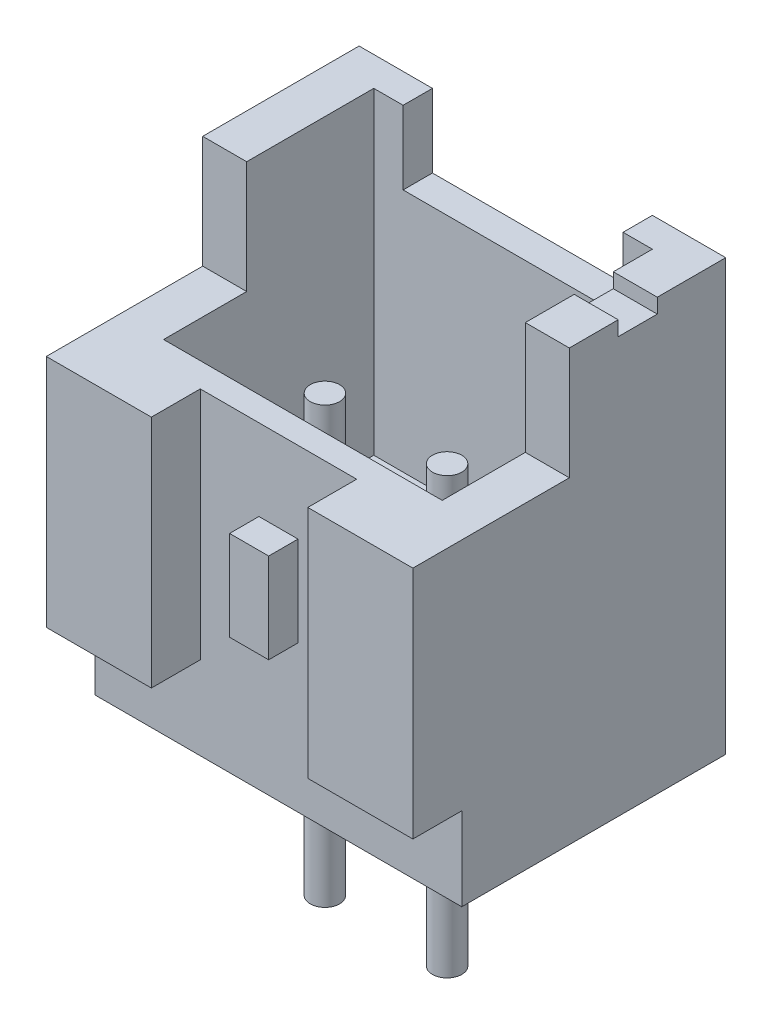
ISO-10303-21;
HEADER;
FILE_DESCRIPTION(('STEP AP214'),'2;1');
FILE_NAME('part.step','',(''),(''),'','','');
FILE_SCHEMA(('AUTOMOTIVE_DESIGN { 1 0 10303 214 1 1 1 1 }'));
ENDSEC;
DATA;
#1=APPLICATION_CONTEXT('core data for automotive mechanical design processes');
#2=APPLICATION_PROTOCOL_DEFINITION('international standard','automotive_design',2000,#1);
#3=PRODUCT_CONTEXT('',#1,'mechanical');
#4=PRODUCT('Part','Part','',(#3));
#5=PRODUCT_RELATED_PRODUCT_CATEGORY('part','',(#4));
#6=PRODUCT_DEFINITION_FORMATION('','',#4);
#7=PRODUCT_DEFINITION_CONTEXT('part definition',#1,'design');
#8=PRODUCT_DEFINITION('design','',#6,#7);
#9=PRODUCT_DEFINITION_SHAPE('','',#8);
#10=(LENGTH_UNIT() NAMED_UNIT(*) SI_UNIT(.MILLI.,.METRE.));
#11=(NAMED_UNIT(*) PLANE_ANGLE_UNIT() SI_UNIT($,.RADIAN.));
#12=(NAMED_UNIT(*) SI_UNIT($,.STERADIAN.) SOLID_ANGLE_UNIT());
#13=UNCERTAINTY_MEASURE_WITH_UNIT(LENGTH_MEASURE(1.E-05),#10,'distance_accuracy_value','');
#14=(GEOMETRIC_REPRESENTATION_CONTEXT(3) GLOBAL_UNCERTAINTY_ASSIGNED_CONTEXT((#13)) GLOBAL_UNIT_ASSIGNED_CONTEXT((#10,
#11,#12)) REPRESENTATION_CONTEXT('',''));
#15=CARTESIAN_POINT('',(0.,0.,0.));
#16=DIRECTION('',(0.,0.,1.));
#17=DIRECTION('',(1.,0.,0.));
#18=AXIS2_PLACEMENT_3D('',#15,#16,#17);
#19=CARTESIAN_POINT('',(1.25,5.5,0.));
#20=DIRECTION('',(0.,1.,0.));
#21=DIRECTION('',(0.,0.,1.));
#22=AXIS2_PLACEMENT_3D('',#19,#20,#21);
#23=PLANE('',#22);
#24=CARTESIAN_POINT('',(1.25,5.5,0.));
#25=DIRECTION('',(0.,-1.,0.));
#26=DIRECTION('',(0.,0.,-1.));
#27=AXIS2_PLACEMENT_3D('',#24,#25,#26);
#28=CIRCLE('',#27,0.3);
#29=CARTESIAN_POINT('',(1.25,5.5,-0.3));
#30=VERTEX_POINT('',#29);
#31=EDGE_CURVE('E20',#30,#30,#28,.T.);
#32=ORIENTED_EDGE('',*,*,#31,.F.);
#33=EDGE_LOOP('',(#32));
#34=FACE_BOUND('',#33,.T.);
#35=ADVANCED_FACE('F17',(#34),#23,.T.);
#36=CARTESIAN_POINT('',(-1.25,5.5,0.));
#37=DIRECTION('',(0.,1.,0.));
#38=DIRECTION('',(0.,0.,1.));
#39=AXIS2_PLACEMENT_3D('',#36,#37,#38);
#40=PLANE('',#39);
#41=CARTESIAN_POINT('',(-1.25,5.5,0.));
#42=DIRECTION('',(0.,-1.,0.));
#43=DIRECTION('',(0.,0.,-1.));
#44=AXIS2_PLACEMENT_3D('',#41,#42,#43);
#45=CIRCLE('',#44,0.3);
#46=CARTESIAN_POINT('',(-1.25,5.5,-0.3));
#47=VERTEX_POINT('',#46);
#48=EDGE_CURVE('E232',#47,#47,#45,.T.);
#49=ORIENTED_EDGE('',*,*,#48,.F.);
#50=EDGE_LOOP('',(#49));
#51=FACE_BOUND('',#50,.T.);
#52=ADVANCED_FACE('F280',(#51),#40,.T.);
#53=CARTESIAN_POINT('',(0.4,3.8,2.8));
#54=DIRECTION('',(0.,0.,-1.));
#55=DIRECTION('',(0.,1.,0.));
#56=AXIS2_PLACEMENT_3D('',#53,#54,#55);
#57=PLANE('',#56);
#58=DIRECTION('',(1.,0.,0.));
#59=VECTOR('',#58,1.);
#60=CARTESIAN_POINT('',(0.4,3.,2.8));
#61=LINE('',#60,#59);
#62=CARTESIAN_POINT('',(-0.4,3.,2.8));
#63=VERTEX_POINT('',#62);
#64=CARTESIAN_POINT('',(0.4,3.,2.8));
#65=VERTEX_POINT('',#64);
#66=EDGE_CURVE('E215',#63,#65,#61,.T.);
#67=ORIENTED_EDGE('',*,*,#66,.T.);
#68=DIRECTION('',(0.,1.,0.));
#69=VECTOR('',#68,1.);
#70=CARTESIAN_POINT('',(0.4,4.839230484541,2.8));
#71=LINE('',#70,#69);
#72=CARTESIAN_POINT('',(0.4,4.839230484541,2.8));
#73=VERTEX_POINT('',#72);
#74=EDGE_CURVE('E210',#73,#65,#71,.F.);
#75=ORIENTED_EDGE('',*,*,#74,.F.);
#76=DIRECTION('',(1.,0.,0.));
#77=VECTOR('',#76,1.);
#78=CARTESIAN_POINT('',(0.4,4.839230484541,2.8));
#79=LINE('',#78,#77);
#80=CARTESIAN_POINT('',(-0.4,4.839230484541,2.8));
#81=VERTEX_POINT('',#80);
#82=EDGE_CURVE('E228',#81,#73,#79,.T.);
#83=ORIENTED_EDGE('',*,*,#82,.F.);
#84=DIRECTION('',(0.,1.,0.));
#85=VECTOR('',#84,1.);
#86=CARTESIAN_POINT('',(-0.4,4.839230484541,2.8));
#87=LINE('',#86,#85);
#88=EDGE_CURVE('E224',#81,#63,#87,.F.);
#89=ORIENTED_EDGE('',*,*,#88,.T.);
#90=EDGE_LOOP('',(#67,#75,#83,#89));
#91=FACE_BOUND('',#90,.T.);
#92=ADVANCED_FACE('F227',(#91),#57,.F.);
#93=CARTESIAN_POINT('',(1.25,5.5,0.));
#94=DIRECTION('',(0.,-1.,0.));
#95=DIRECTION('',(0.,0.,-1.));
#96=AXIS2_PLACEMENT_3D('',#93,#94,#95);
#97=CYLINDRICAL_SURFACE('',#96,0.3);
#98=ORIENTED_EDGE('',*,*,#31,.T.);
#99=EDGE_LOOP('',(#98));
#100=FACE_BOUND('',#99,.T.);
#101=CARTESIAN_POINT('',(1.25,2.3,0.));
#102=DIRECTION('',(0.,-1.,0.));
#103=DIRECTION('',(0.,0.,-1.));
#104=AXIS2_PLACEMENT_3D('',#101,#102,#103);
#105=CIRCLE('',#104,0.3);
#106=CARTESIAN_POINT('',(1.25,2.3,-0.3));
#107=VERTEX_POINT('',#106);
#108=EDGE_CURVE('E266',#107,#107,#105,.F.);
#109=ORIENTED_EDGE('',*,*,#108,.T.);
#110=EDGE_LOOP('',(#109));
#111=FACE_BOUND('',#110,.T.);
#112=ADVANCED_FACE('F276',(#100,#111),#97,.T.);
#113=CARTESIAN_POINT('',(-1.25,5.5,0.));
#114=DIRECTION('',(0.,-1.,0.));
#115=DIRECTION('',(0.,0.,-1.));
#116=AXIS2_PLACEMENT_3D('',#113,#114,#115);
#117=CYLINDRICAL_SURFACE('',#116,0.3);
#118=ORIENTED_EDGE('',*,*,#48,.T.);
#119=EDGE_LOOP('',(#118));
#120=FACE_BOUND('',#119,.T.);
#121=CARTESIAN_POINT('',(-1.25,2.3,0.));
#122=DIRECTION('',(0.,-1.,0.));
#123=DIRECTION('',(0.,0.,-1.));
#124=AXIS2_PLACEMENT_3D('',#121,#122,#123);
#125=CIRCLE('',#124,0.3);
#126=CARTESIAN_POINT('',(-1.25,2.3,-0.3));
#127=VERTEX_POINT('',#126);
#128=EDGE_CURVE('E261',#127,#127,#125,.F.);
#129=ORIENTED_EDGE('',*,*,#128,.T.);
#130=EDGE_LOOP('',(#129));
#131=FACE_BOUND('',#130,.T.);
#132=ADVANCED_FACE('F426',(#120,#131),#117,.T.);
#133=CARTESIAN_POINT('',(1.25,-3.4,0.));
#134=DIRECTION('',(0.,1.,0.));
#135=DIRECTION('',(0.,0.,1.));
#136=AXIS2_PLACEMENT_3D('',#133,#134,#135);
#137=PLANE('',#136);
#138=CARTESIAN_POINT('',(1.25,-3.4,0.));
#139=DIRECTION('',(0.,-1.,0.));
#140=DIRECTION('',(0.,0.,-1.));
#141=AXIS2_PLACEMENT_3D('',#138,#139,#140);
#142=CIRCLE('',#141,0.3);
#143=CARTESIAN_POINT('',(1.25,-3.4,-0.3));
#144=VERTEX_POINT('',#143);
#145=EDGE_CURVE('E257',#144,#144,#142,.F.);
#146=ORIENTED_EDGE('',*,*,#145,.F.);
#147=EDGE_LOOP('',(#146));
#148=FACE_BOUND('',#147,.T.);
#149=ADVANCED_FACE('F423',(#148),#137,.F.);
#150=CARTESIAN_POINT('',(-0.4,4.839230484541,2.2));
#151=DIRECTION('',(1.,0.,0.));
#152=DIRECTION('',(0.,0.,-1.));
#153=AXIS2_PLACEMENT_3D('',#150,#151,#152);
#154=PLANE('',#153);
#155=DIRECTION('',(0.,1.,0.));
#156=VECTOR('',#155,1.);
#157=CARTESIAN_POINT('',(-0.4,0.,2.2));
#158=LINE('',#157,#156);
#159=CARTESIAN_POINT('',(-0.4,4.839230484541,2.2));
#160=VERTEX_POINT('',#159);
#161=CARTESIAN_POINT('',(-0.4,3.,2.2));
#162=VERTEX_POINT('',#161);
#163=EDGE_CURVE('E236',#160,#162,#158,.F.);
#164=ORIENTED_EDGE('',*,*,#163,.T.);
#165=DIRECTION('',(0.,0.,1.));
#166=VECTOR('',#165,1.);
#167=CARTESIAN_POINT('',(-0.4,3.,2.8));
#168=LINE('',#167,#166);
#169=EDGE_CURVE('E220',#162,#63,#168,.T.);
#170=ORIENTED_EDGE('',*,*,#169,.T.);
#171=ORIENTED_EDGE('',*,*,#88,.F.);
#172=DIRECTION('',(0.,0.,-1.));
#173=VECTOR('',#172,1.);
#174=CARTESIAN_POINT('',(-0.4,4.839230484541,2.8));
#175=LINE('',#174,#173);
#176=EDGE_CURVE('E858',#81,#160,#175,.T.);
#177=ORIENTED_EDGE('',*,*,#176,.T.);
#178=EDGE_LOOP('',(#164,#170,#171,#177));
#179=FACE_BOUND('',#178,.T.);
#180=ADVANCED_FACE('F235',(#179),#154,.F.);
#181=CARTESIAN_POINT('',(0.4,3.,2.8));
#182=DIRECTION('',(0.,1.,0.));
#183=DIRECTION('',(0.,0.,1.));
#184=AXIS2_PLACEMENT_3D('',#181,#182,#183);
#185=PLANE('',#184);
#186=DIRECTION('',(-1.,0.,0.));
#187=VECTOR('',#186,1.);
#188=CARTESIAN_POINT('',(-1.6,3.,2.2));
#189=LINE('',#188,#187);
#190=CARTESIAN_POINT('',(0.4,3.,2.2));
#191=VERTEX_POINT('',#190);
#192=EDGE_CURVE('E817',#162,#191,#189,.F.);
#193=ORIENTED_EDGE('',*,*,#192,.T.);
#194=DIRECTION('',(0.,0.,-1.));
#195=VECTOR('',#194,1.);
#196=CARTESIAN_POINT('',(0.4,3.,2.2));
#197=LINE('',#196,#195);
#198=EDGE_CURVE('E222',#65,#191,#197,.T.);
#199=ORIENTED_EDGE('',*,*,#198,.F.);
#200=ORIENTED_EDGE('',*,*,#66,.F.);
#201=ORIENTED_EDGE('',*,*,#169,.F.);
#202=EDGE_LOOP('',(#193,#199,#200,#201));
#203=FACE_BOUND('',#202,.T.);
#204=ADVANCED_FACE('F218',(#203),#185,.F.);
#205=CARTESIAN_POINT('',(0.4,4.839230484541,2.2));
#206=DIRECTION('',(1.,0.,0.));
#207=DIRECTION('',(0.,0.,-1.));
#208=AXIS2_PLACEMENT_3D('',#205,#206,#207);
#209=PLANE('',#208);
#210=ORIENTED_EDGE('',*,*,#198,.T.);
#211=DIRECTION('',(0.,1.,0.));
#212=VECTOR('',#211,1.);
#213=CARTESIAN_POINT('',(0.4,0.,2.2));
#214=LINE('',#213,#212);
#215=CARTESIAN_POINT('',(0.4,4.839230484541,2.2));
#216=VERTEX_POINT('',#215);
#217=EDGE_CURVE('E814',#191,#216,#214,.T.);
#218=ORIENTED_EDGE('',*,*,#217,.T.);
#219=DIRECTION('',(0.,0.,-1.));
#220=VECTOR('',#219,1.);
#221=CARTESIAN_POINT('',(0.4,4.839230484541,2.8));
#222=LINE('',#221,#220);
#223=EDGE_CURVE('E860',#216,#73,#222,.F.);
#224=ORIENTED_EDGE('',*,*,#223,.T.);
#225=ORIENTED_EDGE('',*,*,#74,.T.);
#226=EDGE_LOOP('',(#210,#218,#224,#225));
#227=FACE_BOUND('',#226,.T.);
#228=ADVANCED_FACE('F415',(#227),#209,.T.);
#229=CARTESIAN_POINT('',(0.4,4.839230484541,2.8));
#230=DIRECTION('',(0.,-1.,0.));
#231=DIRECTION('',(0.,0.,-1.));
#232=AXIS2_PLACEMENT_3D('',#229,#230,#231);
#233=PLANE('',#232);
#234=ORIENTED_EDGE('',*,*,#82,.T.);
#235=ORIENTED_EDGE('',*,*,#223,.F.);
#236=DIRECTION('',(-1.,0.,0.));
#237=VECTOR('',#236,1.);
#238=CARTESIAN_POINT('',(-1.6,4.839230484541,2.2));
#239=LINE('',#238,#237);
#240=EDGE_CURVE('E811',#216,#160,#239,.T.);
#241=ORIENTED_EDGE('',*,*,#240,.T.);
#242=ORIENTED_EDGE('',*,*,#176,.F.);
#243=EDGE_LOOP('',(#234,#235,#241,#242));
#244=FACE_BOUND('',#243,.T.);
#245=ADVANCED_FACE('F411',(#244),#233,.F.);
#246=CARTESIAN_POINT('',(-1.6,1.7,2.2));
#247=DIRECTION('',(0.,1.,0.));
#248=DIRECTION('',(0.,0.,1.));
#249=AXIS2_PLACEMENT_3D('',#246,#247,#248);
#250=PLANE('',#249);
#251=DIRECTION('',(0.,0.,1.));
#252=VECTOR('',#251,1.);
#253=CARTESIAN_POINT('',(-3.75,1.7,2.2));
#254=LINE('',#253,#252);
#255=CARTESIAN_POINT('',(-3.75,1.7,2.2));
#256=VERTEX_POINT('',#255);
#257=CARTESIAN_POINT('',(-3.75,1.7,3.2));
#258=VERTEX_POINT('',#257);
#259=EDGE_CURVE('E856',#256,#258,#254,.T.);
#260=ORIENTED_EDGE('',*,*,#259,.F.);
#261=DIRECTION('',(-1.,0.,0.));
#262=VECTOR('',#261,1.);
#263=CARTESIAN_POINT('',(-1.6,1.7,2.2));
#264=LINE('',#263,#262);
#265=CARTESIAN_POINT('',(-1.6,1.7,2.2));
#266=VERTEX_POINT('',#265);
#267=EDGE_CURVE('E800',#256,#266,#264,.F.);
#268=ORIENTED_EDGE('',*,*,#267,.T.);
#269=DIRECTION('',(0.,0.,1.));
#270=VECTOR('',#269,1.);
#271=CARTESIAN_POINT('',(-1.6,1.7,3.2));
#272=LINE('',#271,#270);
#273=CARTESIAN_POINT('',(-1.6,1.7,3.2));
#274=VERTEX_POINT('',#273);
#275=EDGE_CURVE('E851',#266,#274,#272,.T.);
#276=ORIENTED_EDGE('',*,*,#275,.T.);
#277=DIRECTION('',(1.,0.,0.));
#278=VECTOR('',#277,1.);
#279=CARTESIAN_POINT('',(-3.75,1.7,3.2));
#280=LINE('',#279,#278);
#281=EDGE_CURVE('E822',#258,#274,#280,.T.);
#282=ORIENTED_EDGE('',*,*,#281,.F.);
#283=EDGE_LOOP('',(#260,#268,#276,#282));
#284=FACE_BOUND('',#283,.T.);
#285=ADVANCED_FACE('F407',(#284),#250,.F.);
#286=CARTESIAN_POINT('',(-1.6,0.,3.2));
#287=DIRECTION('',(-1.,0.,0.));
#288=DIRECTION('',(0.,0.,1.));
#289=AXIS2_PLACEMENT_3D('',#286,#287,#288);
#290=PLANE('',#289);
#291=ORIENTED_EDGE('',*,*,#275,.F.);
#292=DIRECTION('',(0.,1.,0.));
#293=VECTOR('',#292,1.);
#294=CARTESIAN_POINT('',(-1.6,0.,2.2));
#295=LINE('',#294,#293);
#296=CARTESIAN_POINT('',(-1.6,6.5,2.2));
#297=VERTEX_POINT('',#296);
#298=EDGE_CURVE('E256',#266,#297,#295,.T.);
#299=ORIENTED_EDGE('',*,*,#298,.T.);
#300=DIRECTION('',(0.,0.,1.));
#301=VECTOR('',#300,1.);
#302=CARTESIAN_POINT('',(-1.6,6.5,3.2));
#303=LINE('',#302,#301);
#304=CARTESIAN_POINT('',(-1.6,6.5,3.2));
#305=VERTEX_POINT('',#304);
#306=EDGE_CURVE('E854',#305,#297,#303,.F.);
#307=ORIENTED_EDGE('',*,*,#306,.F.);
#308=DIRECTION('',(0.,1.,0.));
#309=VECTOR('',#308,1.);
#310=CARTESIAN_POINT('',(-1.6,0.,3.2));
#311=LINE('',#310,#309);
#312=EDGE_CURVE('E260',#274,#305,#311,.T.);
#313=ORIENTED_EDGE('',*,*,#312,.F.);
#314=EDGE_LOOP('',(#291,#299,#307,#313));
#315=FACE_BOUND('',#314,.T.);
#316=ADVANCED_FACE('F403',(#315),#290,.F.);
#317=CARTESIAN_POINT('',(-1.25,-3.4,0.));
#318=DIRECTION('',(0.,1.,0.));
#319=DIRECTION('',(0.,0.,1.));
#320=AXIS2_PLACEMENT_3D('',#317,#318,#319);
#321=PLANE('',#320);
#322=CARTESIAN_POINT('',(-1.25,-3.4,0.));
#323=DIRECTION('',(0.,-1.,0.));
#324=DIRECTION('',(0.,0.,-1.));
#325=AXIS2_PLACEMENT_3D('',#322,#323,#324);
#326=CIRCLE('',#325,0.3);
#327=CARTESIAN_POINT('',(-1.25,-3.4,-0.3));
#328=VERTEX_POINT('',#327);
#329=EDGE_CURVE('E252',#328,#328,#326,.F.);
#330=ORIENTED_EDGE('',*,*,#329,.F.);
#331=EDGE_LOOP('',(#330));
#332=FACE_BOUND('',#331,.T.);
#333=ADVANCED_FACE('F399',(#332),#321,.F.);
#334=CARTESIAN_POINT('',(1.6,1.7,2.2));
#335=DIRECTION('',(0.,1.,0.));
#336=DIRECTION('',(-1.,0.,0.));
#337=AXIS2_PLACEMENT_3D('',#334,#335,#336);
#338=PLANE('',#337);
#339=DIRECTION('',(0.,0.,-1.));
#340=VECTOR('',#339,1.);
#341=CARTESIAN_POINT('',(1.6,1.7,3.2));
#342=LINE('',#341,#340);
#343=CARTESIAN_POINT('',(1.6,1.7,3.2));
#344=VERTEX_POINT('',#343);
#345=CARTESIAN_POINT('',(1.6,1.7,2.2));
#346=VERTEX_POINT('',#345);
#347=EDGE_CURVE('E845',#344,#346,#342,.T.);
#348=ORIENTED_EDGE('',*,*,#347,.T.);
#349=DIRECTION('',(-1.,0.,0.));
#350=VECTOR('',#349,1.);
#351=CARTESIAN_POINT('',(-1.6,1.7,2.2));
#352=LINE('',#351,#350);
#353=CARTESIAN_POINT('',(3.75,1.7,2.2));
#354=VERTEX_POINT('',#353);
#355=EDGE_CURVE('E805',#346,#354,#352,.F.);
#356=ORIENTED_EDGE('',*,*,#355,.T.);
#357=DIRECTION('',(0.,0.,1.));
#358=VECTOR('',#357,1.);
#359=CARTESIAN_POINT('',(3.75,1.7,2.2));
#360=LINE('',#359,#358);
#361=CARTESIAN_POINT('',(3.75,1.7,3.2));
#362=VERTEX_POINT('',#361);
#363=EDGE_CURVE('E849',#362,#354,#360,.F.);
#364=ORIENTED_EDGE('',*,*,#363,.F.);
#365=DIRECTION('',(1.,0.,0.));
#366=VECTOR('',#365,1.);
#367=CARTESIAN_POINT('',(-3.75,1.7,3.2));
#368=LINE('',#367,#366);
#369=EDGE_CURVE('E255',#344,#362,#368,.T.);
#370=ORIENTED_EDGE('',*,*,#369,.F.);
#371=EDGE_LOOP('',(#348,#356,#364,#370));
#372=FACE_BOUND('',#371,.T.);
#373=ADVANCED_FACE('F395',(#372),#338,.F.);
#374=CARTESIAN_POINT('',(1.6,0.,3.2));
#375=DIRECTION('',(1.,0.,0.));
#376=DIRECTION('',(0.,0.,-1.));
#377=AXIS2_PLACEMENT_3D('',#374,#375,#376);
#378=PLANE('',#377);
#379=ORIENTED_EDGE('',*,*,#347,.F.);
#380=DIRECTION('',(0.,1.,0.));
#381=VECTOR('',#380,1.);
#382=CARTESIAN_POINT('',(1.6,0.,3.2));
#383=LINE('',#382,#381);
#384=CARTESIAN_POINT('',(1.6,6.5,3.2));
#385=VERTEX_POINT('',#384);
#386=EDGE_CURVE('E793',#385,#344,#383,.F.);
#387=ORIENTED_EDGE('',*,*,#386,.F.);
#388=DIRECTION('',(0.,0.,-1.));
#389=VECTOR('',#388,1.);
#390=CARTESIAN_POINT('',(1.6,6.5,3.2));
#391=LINE('',#390,#389);
#392=CARTESIAN_POINT('',(1.6,6.5,2.2));
#393=VERTEX_POINT('',#392);
#394=EDGE_CURVE('E847',#393,#385,#391,.F.);
#395=ORIENTED_EDGE('',*,*,#394,.F.);
#396=DIRECTION('',(0.,1.,0.));
#397=VECTOR('',#396,1.);
#398=CARTESIAN_POINT('',(1.6,0.,2.2));
#399=LINE('',#398,#397);
#400=EDGE_CURVE('E808',#393,#346,#399,.F.);
#401=ORIENTED_EDGE('',*,*,#400,.T.);
#402=EDGE_LOOP('',(#379,#387,#395,#401));
#403=FACE_BOUND('',#402,.T.);
#404=ADVANCED_FACE('F391',(#403),#378,.F.);
#405=CARTESIAN_POINT('',(-2.85,2.3,1.7));
#406=DIRECTION('',(0.,0.,1.));
#407=DIRECTION('',(1.,0.,0.));
#408=AXIS2_PLACEMENT_3D('',#405,#406,#407);
#409=PLANE('',#408);
#410=DIRECTION('',(1.,0.,0.));
#411=VECTOR('',#410,1.);
#412=CARTESIAN_POINT('',(2.85,2.3,1.7));
#413=LINE('',#412,#411);
#414=CARTESIAN_POINT('',(2.85,2.3,1.7));
#415=VERTEX_POINT('',#414);
#416=CARTESIAN_POINT('',(-2.85,2.3,1.7));
#417=VERTEX_POINT('',#416);
#418=EDGE_CURVE('E268',#415,#417,#413,.F.);
#419=ORIENTED_EDGE('',*,*,#418,.T.);
#420=DIRECTION('',(0.,1.,0.));
#421=VECTOR('',#420,1.);
#422=CARTESIAN_POINT('',(-2.85,2.3,1.7));
#423=LINE('',#422,#421);
#424=CARTESIAN_POINT('',(-2.85,6.5,1.7));
#425=VERTEX_POINT('',#424);
#426=EDGE_CURVE('E836',#417,#425,#423,.T.);
#427=ORIENTED_EDGE('',*,*,#426,.T.);
#428=DIRECTION('',(1.,0.,0.));
#429=VECTOR('',#428,1.);
#430=CARTESIAN_POINT('',(-3.75,6.5,1.7));
#431=LINE('',#430,#429);
#432=CARTESIAN_POINT('',(2.85,6.5,1.7));
#433=VERTEX_POINT('',#432);
#434=EDGE_CURVE('E776',#425,#433,#431,.T.);
#435=ORIENTED_EDGE('',*,*,#434,.T.);
#436=DIRECTION('',(0.,1.,0.));
#437=VECTOR('',#436,1.);
#438=CARTESIAN_POINT('',(2.85,2.3,1.7));
#439=LINE('',#438,#437);
#440=EDGE_CURVE('E842',#433,#415,#439,.F.);
#441=ORIENTED_EDGE('',*,*,#440,.T.);
#442=EDGE_LOOP('',(#419,#427,#435,#441));
#443=FACE_BOUND('',#442,.T.);
#444=ADVANCED_FACE('F387',(#443),#409,.F.);
#445=CARTESIAN_POINT('',(2.85,2.3,1.7));
#446=DIRECTION('',(1.,0.,0.));
#447=DIRECTION('',(0.,0.,-1.));
#448=AXIS2_PLACEMENT_3D('',#445,#446,#447);
#449=PLANE('',#448);
#450=DIRECTION('',(0.,1.,0.));
#451=VECTOR('',#450,1.);
#452=CARTESIAN_POINT('',(2.85,8.5,-1.8));
#453=LINE('',#452,#451);
#454=CARTESIAN_POINT('',(2.85,8.5,-1.8));
#455=VERTEX_POINT('',#454);
#456=CARTESIAN_POINT('',(2.85,8.8,-1.8));
#457=VERTEX_POINT('',#456);
#458=EDGE_CURVE('E744',#455,#457,#453,.T.);
#459=ORIENTED_EDGE('',*,*,#458,.T.);
#460=DIRECTION('',(0.,0.,-1.));
#461=VECTOR('',#460,1.);
#462=CARTESIAN_POINT('',(2.85,8.8,1.7));
#463=LINE('',#462,#461);
#464=CARTESIAN_POINT('',(2.85,8.8,-2.6));
#465=VERTEX_POINT('',#464);
#466=EDGE_CURVE('E269',#465,#457,#463,.F.);
#467=ORIENTED_EDGE('',*,*,#466,.F.);
#468=DIRECTION('',(0.,1.,0.));
#469=VECTOR('',#468,1.);
#470=CARTESIAN_POINT('',(2.85,2.3,-2.6));
#471=LINE('',#470,#469);
#472=CARTESIAN_POINT('',(2.85,2.3,-2.6));
#473=VERTEX_POINT('',#472);
#474=EDGE_CURVE('E739',#465,#473,#471,.F.);
#475=ORIENTED_EDGE('',*,*,#474,.T.);
#476=DIRECTION('',(0.,0.,-1.));
#477=VECTOR('',#476,1.);
#478=CARTESIAN_POINT('',(2.85,2.3,-2.6));
#479=LINE('',#478,#477);
#480=EDGE_CURVE('E265',#473,#415,#479,.F.);
#481=ORIENTED_EDGE('',*,*,#480,.T.);
#482=ORIENTED_EDGE('',*,*,#440,.F.);
#483=DIRECTION('',(0.,0.,1.));
#484=VECTOR('',#483,1.);
#485=CARTESIAN_POINT('',(2.85,6.5,3.2));
#486=LINE('',#485,#484);
#487=CARTESIAN_POINT('',(2.85,6.5,0.));
#488=VERTEX_POINT('',#487);
#489=EDGE_CURVE('E774',#433,#488,#486,.F.);
#490=ORIENTED_EDGE('',*,*,#489,.T.);
#491=DIRECTION('',(0.,1.,0.));
#492=VECTOR('',#491,1.);
#493=CARTESIAN_POINT('',(2.85,8.8,0.));
#494=LINE('',#493,#492);
#495=CARTESIAN_POINT('',(2.85,8.8,0.));
#496=VERTEX_POINT('',#495);
#497=EDGE_CURVE('E769',#488,#496,#494,.T.);
#498=ORIENTED_EDGE('',*,*,#497,.T.);
#499=DIRECTION('',(0.,0.,-1.));
#500=VECTOR('',#499,1.);
#501=CARTESIAN_POINT('',(2.85,8.8,3.2));
#502=LINE('',#501,#500);
#503=CARTESIAN_POINT('',(2.85,8.8,-1.));
#504=VERTEX_POINT('',#503);
#505=EDGE_CURVE('E763',#496,#504,#502,.T.);
#506=ORIENTED_EDGE('',*,*,#505,.T.);
#507=DIRECTION('',(0.,1.,0.));
#508=VECTOR('',#507,1.);
#509=CARTESIAN_POINT('',(2.85,8.5,-1.));
#510=LINE('',#509,#508);
#511=CARTESIAN_POINT('',(2.85,8.5,-1.));
#512=VERTEX_POINT('',#511);
#513=EDGE_CURVE('E760',#504,#512,#510,.F.);
#514=ORIENTED_EDGE('',*,*,#513,.T.);
#515=DIRECTION('',(0.,0.,1.));
#516=VECTOR('',#515,1.);
#517=CARTESIAN_POINT('',(2.85,8.5,-1.));
#518=LINE('',#517,#516);
#519=EDGE_CURVE('E755',#455,#512,#518,.T.);
#520=ORIENTED_EDGE('',*,*,#519,.F.);
#521=EDGE_LOOP('',(#459,#467,#475,#481,#482,#490,#498,#506,#514,#520));
#522=FACE_BOUND('',#521,.T.);
#523=ADVANCED_FACE('F383',(#522),#449,.F.);
#524=CARTESIAN_POINT('',(2.85,2.3,-2.6));
#525=DIRECTION('',(0.,-1.,0.));
#526=DIRECTION('',(0.,0.,-1.));
#527=AXIS2_PLACEMENT_3D('',#524,#525,#526);
#528=PLANE('',#527);
#529=ORIENTED_EDGE('',*,*,#128,.F.);
#530=EDGE_LOOP('',(#529));
#531=FACE_BOUND('',#530,.T.);
#532=DIRECTION('',(-1.,0.,0.));
#533=VECTOR('',#532,1.);
#534=CARTESIAN_POINT('',(-2.85,2.3,-2.6));
#535=LINE('',#534,#533);
#536=CARTESIAN_POINT('',(-2.85,2.3,-2.6));
#537=VERTEX_POINT('',#536);
#538=EDGE_CURVE('E732',#473,#537,#535,.T.);
#539=ORIENTED_EDGE('',*,*,#538,.T.);
#540=DIRECTION('',(0.,0.,1.));
#541=VECTOR('',#540,1.);
#542=CARTESIAN_POINT('',(-2.85,2.3,1.7));
#543=LINE('',#542,#541);
#544=EDGE_CURVE('E264',#537,#417,#543,.T.);
#545=ORIENTED_EDGE('',*,*,#544,.T.);
#546=ORIENTED_EDGE('',*,*,#418,.F.);
#547=ORIENTED_EDGE('',*,*,#480,.F.);
#548=EDGE_LOOP('',(#539,#545,#546,#547));
#549=FACE_BOUND('',#548,.T.);
#550=ORIENTED_EDGE('',*,*,#108,.F.);
#551=EDGE_LOOP('',(#550));
#552=FACE_BOUND('',#551,.T.);
#553=ADVANCED_FACE('F379',(#531,#549,#552),#528,.F.);
#554=CARTESIAN_POINT('',(-2.85,2.3,1.7));
#555=DIRECTION('',(-1.,0.,0.));
#556=DIRECTION('',(0.,0.,1.));
#557=AXIS2_PLACEMENT_3D('',#554,#555,#556);
#558=PLANE('',#557);
#559=ORIENTED_EDGE('',*,*,#426,.F.);
#560=ORIENTED_EDGE('',*,*,#544,.F.);
#561=DIRECTION('',(0.,1.,0.));
#562=VECTOR('',#561,1.);
#563=CARTESIAN_POINT('',(-2.85,2.3,-2.6));
#564=LINE('',#563,#562);
#565=CARTESIAN_POINT('',(-2.85,8.8,-2.6));
#566=VERTEX_POINT('',#565);
#567=EDGE_CURVE('E738',#537,#566,#564,.T.);
#568=ORIENTED_EDGE('',*,*,#567,.T.);
#569=DIRECTION('',(0.,0.,-1.));
#570=VECTOR('',#569,1.);
#571=CARTESIAN_POINT('',(-2.85,8.8,3.2));
#572=LINE('',#571,#570);
#573=CARTESIAN_POINT('',(-2.85,8.8,0.));
#574=VERTEX_POINT('',#573);
#575=EDGE_CURVE('E834',#566,#574,#572,.F.);
#576=ORIENTED_EDGE('',*,*,#575,.T.);
#577=DIRECTION('',(0.,1.,0.));
#578=VECTOR('',#577,1.);
#579=CARTESIAN_POINT('',(-2.85,8.8,0.));
#580=LINE('',#579,#578);
#581=CARTESIAN_POINT('',(-2.85,6.5,0.));
#582=VERTEX_POINT('',#581);
#583=EDGE_CURVE('E824',#574,#582,#580,.F.);
#584=ORIENTED_EDGE('',*,*,#583,.T.);
#585=DIRECTION('',(0.,0.,1.));
#586=VECTOR('',#585,1.);
#587=CARTESIAN_POINT('',(-2.85,6.5,3.2));
#588=LINE('',#587,#586);
#589=EDGE_CURVE('E779',#582,#425,#588,.T.);
#590=ORIENTED_EDGE('',*,*,#589,.T.);
#591=EDGE_LOOP('',(#559,#560,#568,#576,#584,#590));
#592=FACE_BOUND('',#591,.T.);
#593=ADVANCED_FACE('F375',(#592),#558,.F.);
#594=CARTESIAN_POINT('',(-3.75,8.8,3.2));
#595=DIRECTION('',(0.,-1.,0.));
#596=DIRECTION('',(0.,0.,-1.));
#597=AXIS2_PLACEMENT_3D('',#594,#595,#596);
#598=PLANE('',#597);
#599=DIRECTION('',(0.,0.,-1.));
#600=VECTOR('',#599,1.);
#601=CARTESIAN_POINT('',(-2.25,8.8,3.2));
#602=LINE('',#601,#600);
#603=CARTESIAN_POINT('',(-2.25,8.8,-3.2));
#604=VERTEX_POINT('',#603);
#605=CARTESIAN_POINT('',(-2.25,8.8,-2.6));
#606=VERTEX_POINT('',#605);
#607=EDGE_CURVE('E829',#604,#606,#602,.F.);
#608=ORIENTED_EDGE('',*,*,#607,.F.);
#609=DIRECTION('',(1.,0.,0.));
#610=VECTOR('',#609,1.);
#611=CARTESIAN_POINT('',(-3.75,8.8,-3.2));
#612=LINE('',#611,#610);
#613=CARTESIAN_POINT('',(-3.75,8.8,-3.2));
#614=VERTEX_POINT('',#613);
#615=EDGE_CURVE('E831',#614,#604,#612,.T.);
#616=ORIENTED_EDGE('',*,*,#615,.F.);
#617=DIRECTION('',(0.,0.,1.));
#618=VECTOR('',#617,1.);
#619=CARTESIAN_POINT('',(-3.75,8.8,3.2));
#620=LINE('',#619,#618);
#621=CARTESIAN_POINT('',(-3.75,8.8,0.));
#622=VERTEX_POINT('',#621);
#623=EDGE_CURVE('E884',#614,#622,#620,.T.);
#624=ORIENTED_EDGE('',*,*,#623,.T.);
#625=DIRECTION('',(1.,0.,0.));
#626=VECTOR('',#625,1.);
#627=CARTESIAN_POINT('',(-3.75,8.8,0.));
#628=LINE('',#627,#626);
#629=EDGE_CURVE('E826',#622,#574,#628,.T.);
#630=ORIENTED_EDGE('',*,*,#629,.T.);
#631=ORIENTED_EDGE('',*,*,#575,.F.);
#632=DIRECTION('',(-1.,0.,0.));
#633=VECTOR('',#632,1.);
#634=CARTESIAN_POINT('',(-2.85,8.8,-2.6));
#635=LINE('',#634,#633);
#636=EDGE_CURVE('E742',#566,#606,#635,.F.);
#637=ORIENTED_EDGE('',*,*,#636,.T.);
#638=EDGE_LOOP('',(#608,#616,#624,#630,#631,#637));
#639=FACE_BOUND('',#638,.T.);
#640=ADVANCED_FACE('F371',(#639),#598,.F.);
#641=CARTESIAN_POINT('',(-3.75,8.8,0.));
#642=DIRECTION('',(0.,0.,-1.));
#643=DIRECTION('',(0.,1.,0.));
#644=AXIS2_PLACEMENT_3D('',#641,#642,#643);
#645=PLANE('',#644);
#646=ORIENTED_EDGE('',*,*,#583,.F.);
#647=ORIENTED_EDGE('',*,*,#629,.F.);
#648=DIRECTION('',(0.,1.,0.));
#649=VECTOR('',#648,1.);
#650=CARTESIAN_POINT('',(-3.75,8.8,0.));
#651=LINE('',#650,#649);
#652=CARTESIAN_POINT('',(-3.75,6.5,0.));
#653=VERTEX_POINT('',#652);
#654=EDGE_CURVE('E878',#622,#653,#651,.F.);
#655=ORIENTED_EDGE('',*,*,#654,.T.);
#656=DIRECTION('',(1.,0.,0.));
#657=VECTOR('',#656,1.);
#658=CARTESIAN_POINT('',(-3.75,6.5,0.));
#659=LINE('',#658,#657);
#660=EDGE_CURVE('E782',#653,#582,#659,.T.);
#661=ORIENTED_EDGE('',*,*,#660,.T.);
#662=EDGE_LOOP('',(#646,#647,#655,#661));
#663=FACE_BOUND('',#662,.T.);
#664=ADVANCED_FACE('F367',(#663),#645,.F.);
#665=CARTESIAN_POINT('',(-3.75,0.,3.2));
#666=DIRECTION('',(0.,0.,1.));
#667=DIRECTION('',(1.,0.,0.));
#668=AXIS2_PLACEMENT_3D('',#665,#666,#667);
#669=PLANE('',#668);
#670=DIRECTION('',(1.,0.,0.));
#671=VECTOR('',#670,1.);
#672=CARTESIAN_POINT('',(-3.75,6.5,3.2));
#673=LINE('',#672,#671);
#674=CARTESIAN_POINT('',(-3.75,6.5,3.2));
#675=VERTEX_POINT('',#674);
#676=EDGE_CURVE('E785',#305,#675,#673,.F.);
#677=ORIENTED_EDGE('',*,*,#676,.T.);
#678=DIRECTION('',(0.,1.,0.));
#679=VECTOR('',#678,1.);
#680=CARTESIAN_POINT('',(-3.75,8.8,3.2));
#681=LINE('',#680,#679);
#682=EDGE_CURVE('E869',#675,#258,#681,.F.);
#683=ORIENTED_EDGE('',*,*,#682,.T.);
#684=ORIENTED_EDGE('',*,*,#281,.T.);
#685=ORIENTED_EDGE('',*,*,#312,.T.);
#686=EDGE_LOOP('',(#677,#683,#684,#685));
#687=FACE_BOUND('',#686,.T.);
#688=ADVANCED_FACE('F363',(#687),#669,.T.);
#689=CARTESIAN_POINT('',(1.25,5.5,0.));
#690=DIRECTION('',(0.,-1.,0.));
#691=DIRECTION('',(0.,0.,-1.));
#692=AXIS2_PLACEMENT_3D('',#689,#690,#691);
#693=CYLINDRICAL_SURFACE('',#692,0.3);
#694=ORIENTED_EDGE('',*,*,#145,.T.);
#695=EDGE_LOOP('',(#694));
#696=FACE_BOUND('',#695,.T.);
#697=CARTESIAN_POINT('',(1.25,0.,0.));
#698=DIRECTION('',(0.,-1.,0.));
#699=DIRECTION('',(0.,0.,-1.));
#700=AXIS2_PLACEMENT_3D('',#697,#698,#699);
#701=CIRCLE('',#700,0.3);
#702=CARTESIAN_POINT('',(1.25,0.,-0.3));
#703=VERTEX_POINT('',#702);
#704=EDGE_CURVE('E247',#703,#703,#701,.T.);
#705=ORIENTED_EDGE('',*,*,#704,.T.);
#706=EDGE_LOOP('',(#705));
#707=FACE_BOUND('',#706,.T.);
#708=ADVANCED_FACE('F359',(#696,#707),#693,.T.);
#709=CARTESIAN_POINT('',(-1.6,0.,2.2));
#710=DIRECTION('',(0.,0.,-1.));
#711=DIRECTION('',(-1.,0.,0.));
#712=AXIS2_PLACEMENT_3D('',#709,#710,#711);
#713=PLANE('',#712);
#714=ORIENTED_EDGE('',*,*,#298,.F.);
#715=ORIENTED_EDGE('',*,*,#267,.F.);
#716=DIRECTION('',(0.,1.,0.));
#717=VECTOR('',#716,1.);
#718=CARTESIAN_POINT('',(-3.75,8.8,2.2));
#719=LINE('',#718,#717);
#720=CARTESIAN_POINT('',(-3.75,0.,2.2));
#721=VERTEX_POINT('',#720);
#722=EDGE_CURVE('E251',#256,#721,#719,.F.);
#723=ORIENTED_EDGE('',*,*,#722,.T.);
#724=DIRECTION('',(1.,0.,0.));
#725=VECTOR('',#724,1.);
#726=CARTESIAN_POINT('',(-3.75,0.,2.2));
#727=LINE('',#726,#725);
#728=CARTESIAN_POINT('',(3.75,0.,2.2));
#729=VERTEX_POINT('',#728);
#730=EDGE_CURVE('E246',#721,#729,#727,.T.);
#731=ORIENTED_EDGE('',*,*,#730,.T.);
#732=DIRECTION('',(0.,1.,0.));
#733=VECTOR('',#732,1.);
#734=CARTESIAN_POINT('',(3.75,0.,2.2));
#735=LINE('',#734,#733);
#736=EDGE_CURVE('E803',#354,#729,#735,.F.);
#737=ORIENTED_EDGE('',*,*,#736,.F.);
#738=ORIENTED_EDGE('',*,*,#355,.F.);
#739=ORIENTED_EDGE('',*,*,#400,.F.);
#740=DIRECTION('',(1.,0.,0.));
#741=VECTOR('',#740,1.);
#742=CARTESIAN_POINT('',(-3.75,6.5,2.2));
#743=LINE('',#742,#741);
#744=EDGE_CURVE('E787',#393,#297,#743,.F.);
#745=ORIENTED_EDGE('',*,*,#744,.T.);
#746=EDGE_LOOP('',(#714,#715,#723,#731,#737,#738,#739,#745));
#747=FACE_BOUND('',#746,.T.);
#748=ORIENTED_EDGE('',*,*,#217,.F.);
#749=ORIENTED_EDGE('',*,*,#192,.F.);
#750=ORIENTED_EDGE('',*,*,#163,.F.);
#751=ORIENTED_EDGE('',*,*,#240,.F.);
#752=EDGE_LOOP('',(#748,#749,#750,#751));
#753=FACE_BOUND('',#752,.T.);
#754=ADVANCED_FACE('F355',(#747,#753),#713,.F.);
#755=CARTESIAN_POINT('',(-1.25,5.5,0.));
#756=DIRECTION('',(0.,-1.,0.));
#757=DIRECTION('',(0.,0.,-1.));
#758=AXIS2_PLACEMENT_3D('',#755,#756,#757);
#759=CYLINDRICAL_SURFACE('',#758,0.3);
#760=ORIENTED_EDGE('',*,*,#329,.T.);
#761=EDGE_LOOP('',(#760));
#762=FACE_BOUND('',#761,.T.);
#763=CARTESIAN_POINT('',(-1.25,0.,0.));
#764=DIRECTION('',(0.,-1.,0.));
#765=DIRECTION('',(0.,0.,-1.));
#766=AXIS2_PLACEMENT_3D('',#763,#764,#765);
#767=CIRCLE('',#766,0.3);
#768=CARTESIAN_POINT('',(-1.25,0.,-0.3));
#769=VERTEX_POINT('',#768);
#770=EDGE_CURVE('E242',#769,#769,#767,.T.);
#771=ORIENTED_EDGE('',*,*,#770,.T.);
#772=EDGE_LOOP('',(#771));
#773=FACE_BOUND('',#772,.T.);
#774=ADVANCED_FACE('F351',(#762,#773),#759,.T.);
#775=CARTESIAN_POINT('',(-3.75,0.,3.2));
#776=DIRECTION('',(0.,0.,1.));
#777=DIRECTION('',(1.,0.,0.));
#778=AXIS2_PLACEMENT_3D('',#775,#776,#777);
#779=PLANE('',#778);
#780=DIRECTION('',(1.,0.,0.));
#781=VECTOR('',#780,1.);
#782=CARTESIAN_POINT('',(-3.75,6.5,3.2));
#783=LINE('',#782,#781);
#784=CARTESIAN_POINT('',(3.75,6.5,3.2));
#785=VERTEX_POINT('',#784);
#786=EDGE_CURVE('E790',#785,#385,#783,.F.);
#787=ORIENTED_EDGE('',*,*,#786,.T.);
#788=ORIENTED_EDGE('',*,*,#386,.T.);
#789=ORIENTED_EDGE('',*,*,#369,.T.);
#790=DIRECTION('',(0.,-1.,0.));
#791=VECTOR('',#790,1.);
#792=CARTESIAN_POINT('',(3.75,8.8,3.2));
#793=LINE('',#792,#791);
#794=EDGE_CURVE('E920',#362,#785,#793,.F.);
#795=ORIENTED_EDGE('',*,*,#794,.T.);
#796=EDGE_LOOP('',(#787,#788,#789,#795));
#797=FACE_BOUND('',#796,.T.);
#798=ADVANCED_FACE('F347',(#797),#779,.T.);
#799=CARTESIAN_POINT('',(-3.75,6.5,3.2));
#800=DIRECTION('',(0.,-1.,0.));
#801=DIRECTION('',(1.,0.,0.));
#802=AXIS2_PLACEMENT_3D('',#799,#800,#801);
#803=PLANE('',#802);
#804=ORIENTED_EDGE('',*,*,#489,.F.);
#805=ORIENTED_EDGE('',*,*,#434,.F.);
#806=ORIENTED_EDGE('',*,*,#589,.F.);
#807=ORIENTED_EDGE('',*,*,#660,.F.);
#808=DIRECTION('',(0.,0.,1.));
#809=VECTOR('',#808,1.);
#810=CARTESIAN_POINT('',(-3.75,6.5,3.2));
#811=LINE('',#810,#809);
#812=EDGE_CURVE('E875',#653,#675,#811,.T.);
#813=ORIENTED_EDGE('',*,*,#812,.T.);
#814=ORIENTED_EDGE('',*,*,#676,.F.);
#815=ORIENTED_EDGE('',*,*,#306,.T.);
#816=ORIENTED_EDGE('',*,*,#744,.F.);
#817=ORIENTED_EDGE('',*,*,#394,.T.);
#818=ORIENTED_EDGE('',*,*,#786,.F.);
#819=DIRECTION('',(0.,0.,1.));
#820=VECTOR('',#819,1.);
#821=CARTESIAN_POINT('',(3.75,6.5,3.2));
#822=LINE('',#821,#820);
#823=CARTESIAN_POINT('',(3.75,6.5,0.));
#824=VERTEX_POINT('',#823);
#825=EDGE_CURVE('E915',#785,#824,#822,.F.);
#826=ORIENTED_EDGE('',*,*,#825,.T.);
#827=DIRECTION('',(1.,0.,0.));
#828=VECTOR('',#827,1.);
#829=CARTESIAN_POINT('',(-3.75,6.5,0.));
#830=LINE('',#829,#828);
#831=EDGE_CURVE('E771',#824,#488,#830,.F.);
#832=ORIENTED_EDGE('',*,*,#831,.T.);
#833=EDGE_LOOP('',(#804,#805,#806,#807,#813,#814,#815,#816,#817,#818,#826,#832));
#834=FACE_BOUND('',#833,.T.);
#835=ADVANCED_FACE('F343',(#834),#803,.F.);
#836=CARTESIAN_POINT('',(-3.75,8.8,0.));
#837=DIRECTION('',(0.,0.,-1.));
#838=DIRECTION('',(0.,1.,0.));
#839=AXIS2_PLACEMENT_3D('',#836,#837,#838);
#840=PLANE('',#839);
#841=ORIENTED_EDGE('',*,*,#497,.F.);
#842=ORIENTED_EDGE('',*,*,#831,.F.);
#843=DIRECTION('',(0.,-1.,0.));
#844=VECTOR('',#843,1.);
#845=CARTESIAN_POINT('',(3.75,8.8,0.));
#846=LINE('',#845,#844);
#847=CARTESIAN_POINT('',(3.75,8.8,0.));
#848=VERTEX_POINT('',#847);
#849=EDGE_CURVE('E902',#824,#848,#846,.F.);
#850=ORIENTED_EDGE('',*,*,#849,.T.);
#851=DIRECTION('',(1.,0.,0.));
#852=VECTOR('',#851,1.);
#853=CARTESIAN_POINT('',(-3.75,8.8,0.));
#854=LINE('',#853,#852);
#855=EDGE_CURVE('E766',#848,#496,#854,.F.);
#856=ORIENTED_EDGE('',*,*,#855,.T.);
#857=EDGE_LOOP('',(#841,#842,#850,#856));
#858=FACE_BOUND('',#857,.T.);
#859=ADVANCED_FACE('F339',(#858),#840,.F.);
#860=CARTESIAN_POINT('',(-3.75,8.8,3.2));
#861=DIRECTION('',(0.,-1.,0.));
#862=DIRECTION('',(0.,0.,-1.));
#863=AXIS2_PLACEMENT_3D('',#860,#861,#862);
#864=PLANE('',#863);
#865=DIRECTION('',(1.,0.,0.));
#866=VECTOR('',#865,1.);
#867=CARTESIAN_POINT('',(2.85,8.8,-1.));
#868=LINE('',#867,#866);
#869=CARTESIAN_POINT('',(3.75,8.8,-1.));
#870=VERTEX_POINT('',#869);
#871=EDGE_CURVE('E757',#870,#504,#868,.F.);
#872=ORIENTED_EDGE('',*,*,#871,.T.);
#873=ORIENTED_EDGE('',*,*,#505,.F.);
#874=ORIENTED_EDGE('',*,*,#855,.F.);
#875=DIRECTION('',(0.,0.,1.));
#876=VECTOR('',#875,1.);
#877=CARTESIAN_POINT('',(3.75,8.8,3.2));
#878=LINE('',#877,#876);
#879=EDGE_CURVE('E905',#848,#870,#878,.F.);
#880=ORIENTED_EDGE('',*,*,#879,.T.);
#881=EDGE_LOOP('',(#872,#873,#874,#880));
#882=FACE_BOUND('',#881,.T.);
#883=ADVANCED_FACE('F335',(#882),#864,.F.);
#884=CARTESIAN_POINT('',(2.85,8.5,-1.));
#885=DIRECTION('',(0.,0.,1.));
#886=DIRECTION('',(1.,0.,0.));
#887=AXIS2_PLACEMENT_3D('',#884,#885,#886);
#888=PLANE('',#887);
#889=DIRECTION('',(0.,-1.,0.));
#890=VECTOR('',#889,1.);
#891=CARTESIAN_POINT('',(3.75,8.8,-1.));
#892=LINE('',#891,#890);
#893=CARTESIAN_POINT('',(3.75,8.5,-1.));
#894=VERTEX_POINT('',#893);
#895=EDGE_CURVE('E911',#870,#894,#892,.T.);
#896=ORIENTED_EDGE('',*,*,#895,.T.);
#897=DIRECTION('',(1.,0.,0.));
#898=VECTOR('',#897,1.);
#899=CARTESIAN_POINT('',(2.85,8.5,-1.));
#900=LINE('',#899,#898);
#901=EDGE_CURVE('E753',#512,#894,#900,.T.);
#902=ORIENTED_EDGE('',*,*,#901,.F.);
#903=ORIENTED_EDGE('',*,*,#513,.F.);
#904=ORIENTED_EDGE('',*,*,#871,.F.);
#905=EDGE_LOOP('',(#896,#902,#903,#904));
#906=FACE_BOUND('',#905,.T.);
#907=ADVANCED_FACE('F331',(#906),#888,.F.);
#908=CARTESIAN_POINT('',(2.85,8.5,-1.));
#909=DIRECTION('',(0.,1.,0.));
#910=DIRECTION('',(0.,0.,1.));
#911=AXIS2_PLACEMENT_3D('',#908,#909,#910);
#912=PLANE('',#911);
#913=DIRECTION('',(0.,0.,1.));
#914=VECTOR('',#913,1.);
#915=CARTESIAN_POINT('',(3.75,8.5,3.2));
#916=LINE('',#915,#914);
#917=CARTESIAN_POINT('',(3.75,8.5,-1.8));
#918=VERTEX_POINT('',#917);
#919=EDGE_CURVE('E913',#894,#918,#916,.F.);
#920=ORIENTED_EDGE('',*,*,#919,.T.);
#921=DIRECTION('',(-1.,0.,0.));
#922=VECTOR('',#921,1.);
#923=CARTESIAN_POINT('',(2.85,8.5,-1.8));
#924=LINE('',#923,#922);
#925=EDGE_CURVE('E750',#918,#455,#924,.T.);
#926=ORIENTED_EDGE('',*,*,#925,.T.);
#927=ORIENTED_EDGE('',*,*,#519,.T.);
#928=ORIENTED_EDGE('',*,*,#901,.T.);
#929=EDGE_LOOP('',(#920,#926,#927,#928));
#930=FACE_BOUND('',#929,.T.);
#931=ADVANCED_FACE('F327',(#930),#912,.T.);
#932=CARTESIAN_POINT('',(2.85,8.5,-1.8));
#933=DIRECTION('',(0.,0.,-1.));
#934=DIRECTION('',(-1.,0.,0.));
#935=AXIS2_PLACEMENT_3D('',#932,#933,#934);
#936=PLANE('',#935);
#937=ORIENTED_EDGE('',*,*,#458,.F.);
#938=ORIENTED_EDGE('',*,*,#925,.F.);
#939=DIRECTION('',(0.,-1.,0.));
#940=VECTOR('',#939,1.);
#941=CARTESIAN_POINT('',(3.75,8.8,-1.8));
#942=LINE('',#941,#940);
#943=CARTESIAN_POINT('',(3.75,8.8,-1.8));
#944=VERTEX_POINT('',#943);
#945=EDGE_CURVE('E965',#918,#944,#942,.F.);
#946=ORIENTED_EDGE('',*,*,#945,.T.);
#947=DIRECTION('',(1.,0.,0.));
#948=VECTOR('',#947,1.);
#949=CARTESIAN_POINT('',(-3.75,8.8,-1.8));
#950=LINE('',#949,#948);
#951=EDGE_CURVE('E957',#944,#457,#950,.F.);
#952=ORIENTED_EDGE('',*,*,#951,.T.);
#953=EDGE_LOOP('',(#937,#938,#946,#952));
#954=FACE_BOUND('',#953,.T.);
#955=ADVANCED_FACE('F323',(#954),#936,.F.);
#956=CARTESIAN_POINT('',(-2.85,2.3,-2.6));
#957=DIRECTION('',(0.,0.,-1.));
#958=DIRECTION('',(-1.,0.,0.));
#959=AXIS2_PLACEMENT_3D('',#956,#957,#958);
#960=PLANE('',#959);
#961=DIRECTION('',(0.,1.,0.));
#962=VECTOR('',#961,1.);
#963=CARTESIAN_POINT('',(-2.25,2.3,-2.6));
#964=LINE('',#963,#962);
#965=CARTESIAN_POINT('',(-2.25,7.3,-2.6));
#966=VERTEX_POINT('',#965);
#967=EDGE_CURVE('E887',#606,#966,#964,.F.);
#968=ORIENTED_EDGE('',*,*,#967,.F.);
#969=ORIENTED_EDGE('',*,*,#636,.F.);
#970=ORIENTED_EDGE('',*,*,#567,.F.);
#971=ORIENTED_EDGE('',*,*,#538,.F.);
#972=ORIENTED_EDGE('',*,*,#474,.F.);
#973=DIRECTION('',(1.,0.,0.));
#974=VECTOR('',#973,1.);
#975=CARTESIAN_POINT('',(-3.75,8.8,-2.6));
#976=LINE('',#975,#974);
#977=CARTESIAN_POINT('',(2.25,8.8,-2.6));
#978=VERTEX_POINT('',#977);
#979=EDGE_CURVE('E963',#465,#978,#976,.F.);
#980=ORIENTED_EDGE('',*,*,#979,.T.);
#981=DIRECTION('',(0.,1.,0.));
#982=VECTOR('',#981,1.);
#983=CARTESIAN_POINT('',(2.25,8.8,-2.6));
#984=LINE('',#983,#982);
#985=CARTESIAN_POINT('',(2.25,7.3,-2.6));
#986=VERTEX_POINT('',#985);
#987=EDGE_CURVE('E952',#978,#986,#984,.F.);
#988=ORIENTED_EDGE('',*,*,#987,.T.);
#989=DIRECTION('',(1.,0.,0.));
#990=VECTOR('',#989,1.);
#991=CARTESIAN_POINT('',(-2.25,7.3,-2.6));
#992=LINE('',#991,#990);
#993=EDGE_CURVE('E947',#986,#966,#992,.F.);
#994=ORIENTED_EDGE('',*,*,#993,.T.);
#995=EDGE_LOOP('',(#968,#969,#970,#971,#972,#980,#988,#994));
#996=FACE_BOUND('',#995,.T.);
#997=ADVANCED_FACE('F319',(#996),#960,.F.);
#998=CARTESIAN_POINT('',(-3.75,8.8,3.2));
#999=DIRECTION('',(1.,0.,0.));
#1000=DIRECTION('',(0.,1.,0.));
#1001=AXIS2_PLACEMENT_3D('',#998,#999,#1000);
#1002=PLANE('',#1001);
#1003=ORIENTED_EDGE('',*,*,#259,.T.);
#1004=ORIENTED_EDGE('',*,*,#682,.F.);
#1005=ORIENTED_EDGE('',*,*,#812,.F.);
#1006=ORIENTED_EDGE('',*,*,#654,.F.);
#1007=ORIENTED_EDGE('',*,*,#623,.F.);
#1008=DIRECTION('',(0.,1.,0.));
#1009=VECTOR('',#1008,1.);
#1010=CARTESIAN_POINT('',(-3.75,0.,-3.2));
#1011=LINE('',#1010,#1009);
#1012=CARTESIAN_POINT('',(-3.75,0.,-3.2));
#1013=VERTEX_POINT('',#1012);
#1014=EDGE_CURVE('E929',#614,#1013,#1011,.F.);
#1015=ORIENTED_EDGE('',*,*,#1014,.T.);
#1016=DIRECTION('',(0.,0.,1.));
#1017=VECTOR('',#1016,1.);
#1018=CARTESIAN_POINT('',(-3.75,0.,3.2));
#1019=LINE('',#1018,#1017);
#1020=EDGE_CURVE('E250',#1013,#721,#1019,.T.);
#1021=ORIENTED_EDGE('',*,*,#1020,.T.);
#1022=ORIENTED_EDGE('',*,*,#722,.F.);
#1023=EDGE_LOOP('',(#1003,#1004,#1005,#1006,#1007,#1015,#1021,#1022));
#1024=FACE_BOUND('',#1023,.T.);
#1025=ADVANCED_FACE('F315',(#1024),#1002,.F.);
#1026=CARTESIAN_POINT('',(-3.75,0.,3.2));
#1027=DIRECTION('',(0.,1.,0.));
#1028=DIRECTION('',(0.,0.,1.));
#1029=AXIS2_PLACEMENT_3D('',#1026,#1027,#1028);
#1030=PLANE('',#1029);
#1031=ORIENTED_EDGE('',*,*,#770,.F.);
#1032=EDGE_LOOP('',(#1031));
#1033=FACE_BOUND('',#1032,.T.);
#1034=ORIENTED_EDGE('',*,*,#730,.F.);
#1035=ORIENTED_EDGE('',*,*,#1020,.F.);
#1036=DIRECTION('',(1.,0.,0.));
#1037=VECTOR('',#1036,1.);
#1038=CARTESIAN_POINT('',(-3.75,0.,-3.2));
#1039=LINE('',#1038,#1037);
#1040=CARTESIAN_POINT('',(3.75,0.,-3.2));
#1041=VERTEX_POINT('',#1040);
#1042=EDGE_CURVE('E935',#1013,#1041,#1039,.T.);
#1043=ORIENTED_EDGE('',*,*,#1042,.T.);
#1044=DIRECTION('',(0.,0.,1.));
#1045=VECTOR('',#1044,1.);
#1046=CARTESIAN_POINT('',(3.75,0.,3.2));
#1047=LINE('',#1046,#1045);
#1048=EDGE_CURVE('E245',#1041,#729,#1047,.T.);
#1049=ORIENTED_EDGE('',*,*,#1048,.T.);
#1050=EDGE_LOOP('',(#1034,#1035,#1043,#1049));
#1051=FACE_BOUND('',#1050,.T.);
#1052=ORIENTED_EDGE('',*,*,#704,.F.);
#1053=EDGE_LOOP('',(#1052));
#1054=FACE_BOUND('',#1053,.T.);
#1055=ADVANCED_FACE('F311',(#1033,#1051,#1054),#1030,.F.);
#1056=CARTESIAN_POINT('',(3.75,8.8,3.2));
#1057=DIRECTION('',(-1.,0.,0.));
#1058=DIRECTION('',(0.,-1.,0.));
#1059=AXIS2_PLACEMENT_3D('',#1056,#1057,#1058);
#1060=PLANE('',#1059);
#1061=ORIENTED_EDGE('',*,*,#945,.F.);
#1062=ORIENTED_EDGE('',*,*,#919,.F.);
#1063=ORIENTED_EDGE('',*,*,#895,.F.);
#1064=ORIENTED_EDGE('',*,*,#879,.F.);
#1065=ORIENTED_EDGE('',*,*,#849,.F.);
#1066=ORIENTED_EDGE('',*,*,#825,.F.);
#1067=ORIENTED_EDGE('',*,*,#794,.F.);
#1068=ORIENTED_EDGE('',*,*,#363,.T.);
#1069=ORIENTED_EDGE('',*,*,#736,.T.);
#1070=ORIENTED_EDGE('',*,*,#1048,.F.);
#1071=DIRECTION('',(0.,1.,0.));
#1072=VECTOR('',#1071,1.);
#1073=CARTESIAN_POINT('',(3.75,0.,-3.2));
#1074=LINE('',#1073,#1072);
#1075=CARTESIAN_POINT('',(3.75,8.8,-3.2));
#1076=VERTEX_POINT('',#1075);
#1077=EDGE_CURVE('E939',#1041,#1076,#1074,.T.);
#1078=ORIENTED_EDGE('',*,*,#1077,.T.);
#1079=DIRECTION('',(0.,0.,-1.));
#1080=VECTOR('',#1079,1.);
#1081=CARTESIAN_POINT('',(3.75,8.8,3.2));
#1082=LINE('',#1081,#1080);
#1083=EDGE_CURVE('E960',#1076,#944,#1082,.F.);
#1084=ORIENTED_EDGE('',*,*,#1083,.T.);
#1085=EDGE_LOOP('',(#1061,#1062,#1063,#1064,#1065,#1066,#1067,#1068,#1069,#1070,#1078,#1084));
#1086=FACE_BOUND('',#1085,.T.);
#1087=ADVANCED_FACE('F307',(#1086),#1060,.F.);
#1088=CARTESIAN_POINT('',(-3.75,8.8,3.2));
#1089=DIRECTION('',(0.,-1.,0.));
#1090=DIRECTION('',(0.,0.,-1.));
#1091=AXIS2_PLACEMENT_3D('',#1088,#1089,#1090);
#1092=PLANE('',#1091);
#1093=ORIENTED_EDGE('',*,*,#951,.F.);
#1094=ORIENTED_EDGE('',*,*,#1083,.F.);
#1095=DIRECTION('',(1.,0.,0.));
#1096=VECTOR('',#1095,1.);
#1097=CARTESIAN_POINT('',(-3.75,8.8,-3.2));
#1098=LINE('',#1097,#1096);
#1099=CARTESIAN_POINT('',(2.25,8.8,-3.2));
#1100=VERTEX_POINT('',#1099);
#1101=EDGE_CURVE('E941',#1076,#1100,#1098,.F.);
#1102=ORIENTED_EDGE('',*,*,#1101,.T.);
#1103=DIRECTION('',(0.,0.,-1.));
#1104=VECTOR('',#1103,1.);
#1105=CARTESIAN_POINT('',(2.25,8.8,-3.2));
#1106=LINE('',#1105,#1104);
#1107=EDGE_CURVE('E954',#1100,#978,#1106,.F.);
#1108=ORIENTED_EDGE('',*,*,#1107,.T.);
#1109=ORIENTED_EDGE('',*,*,#979,.F.);
#1110=ORIENTED_EDGE('',*,*,#466,.T.);
#1111=EDGE_LOOP('',(#1093,#1094,#1102,#1108,#1109,#1110));
#1112=FACE_BOUND('',#1111,.T.);
#1113=ADVANCED_FACE('F303',(#1112),#1092,.F.);
#1114=CARTESIAN_POINT('',(2.25,8.8,-3.2));
#1115=DIRECTION('',(1.,0.,0.));
#1116=DIRECTION('',(0.,0.,-1.));
#1117=AXIS2_PLACEMENT_3D('',#1114,#1115,#1116);
#1118=PLANE('',#1117);
#1119=ORIENTED_EDGE('',*,*,#1107,.F.);
#1120=DIRECTION('',(0.,1.,0.));
#1121=VECTOR('',#1120,1.);
#1122=CARTESIAN_POINT('',(2.25,0.,-3.2));
#1123=LINE('',#1122,#1121);
#1124=CARTESIAN_POINT('',(2.25,7.3,-3.2));
#1125=VERTEX_POINT('',#1124);
#1126=EDGE_CURVE('E984',#1100,#1125,#1123,.F.);
#1127=ORIENTED_EDGE('',*,*,#1126,.T.);
#1128=DIRECTION('',(0.,0.,-1.));
#1129=VECTOR('',#1128,1.);
#1130=CARTESIAN_POINT('',(2.25,7.3,-3.2));
#1131=LINE('',#1130,#1129);
#1132=EDGE_CURVE('E949',#1125,#986,#1131,.F.);
#1133=ORIENTED_EDGE('',*,*,#1132,.T.);
#1134=ORIENTED_EDGE('',*,*,#987,.F.);
#1135=EDGE_LOOP('',(#1119,#1127,#1133,#1134));
#1136=FACE_BOUND('',#1135,.T.);
#1137=ADVANCED_FACE('F299',(#1136),#1118,.F.);
#1138=CARTESIAN_POINT('',(-2.25,7.3,-3.2));
#1139=DIRECTION('',(0.,-1.,0.));
#1140=DIRECTION('',(0.,0.,-1.));
#1141=AXIS2_PLACEMENT_3D('',#1138,#1139,#1140);
#1142=PLANE('',#1141);
#1143=ORIENTED_EDGE('',*,*,#1132,.F.);
#1144=DIRECTION('',(1.,0.,0.));
#1145=VECTOR('',#1144,1.);
#1146=CARTESIAN_POINT('',(-3.75,7.3,-3.2));
#1147=LINE('',#1146,#1145);
#1148=CARTESIAN_POINT('',(-2.25,7.3,-3.2));
#1149=VERTEX_POINT('',#1148);
#1150=EDGE_CURVE('E26',#1125,#1149,#1147,.F.);
#1151=ORIENTED_EDGE('',*,*,#1150,.T.);
#1152=DIRECTION('',(0.,0.,1.));
#1153=VECTOR('',#1152,1.);
#1154=CARTESIAN_POINT('',(-2.25,7.3,-3.2));
#1155=LINE('',#1154,#1153);
#1156=EDGE_CURVE('E34',#1149,#966,#1155,.T.);
#1157=ORIENTED_EDGE('',*,*,#1156,.T.);
#1158=ORIENTED_EDGE('',*,*,#993,.F.);
#1159=EDGE_LOOP('',(#1143,#1151,#1157,#1158));
#1160=FACE_BOUND('',#1159,.T.);
#1161=ADVANCED_FACE('F294',(#1160),#1142,.F.);
#1162=CARTESIAN_POINT('',(-2.25,8.8,-3.2));
#1163=DIRECTION('',(-1.,0.,0.));
#1164=DIRECTION('',(0.,0.,1.));
#1165=AXIS2_PLACEMENT_3D('',#1162,#1163,#1164);
#1166=PLANE('',#1165);
#1167=ORIENTED_EDGE('',*,*,#1156,.F.);
#1168=DIRECTION('',(0.,1.,0.));
#1169=VECTOR('',#1168,1.);
#1170=CARTESIAN_POINT('',(-2.25,0.,-3.2));
#1171=LINE('',#1170,#1169);
#1172=EDGE_CURVE('E11',#1149,#604,#1171,.T.);
#1173=ORIENTED_EDGE('',*,*,#1172,.T.);
#1174=ORIENTED_EDGE('',*,*,#607,.T.);
#1175=ORIENTED_EDGE('',*,*,#967,.T.);
#1176=EDGE_LOOP('',(#1167,#1173,#1174,#1175));
#1177=FACE_BOUND('',#1176,.T.);
#1178=ADVANCED_FACE('F288',(#1177),#1166,.F.);
#1179=CARTESIAN_POINT('',(-3.75,0.,-3.2));
#1180=DIRECTION('',(0.,0.,1.));
#1181=DIRECTION('',(1.,0.,0.));
#1182=AXIS2_PLACEMENT_3D('',#1179,#1180,#1181);
#1183=PLANE('',#1182);
#1184=ORIENTED_EDGE('',*,*,#1172,.F.);
#1185=ORIENTED_EDGE('',*,*,#1150,.F.);
#1186=ORIENTED_EDGE('',*,*,#1126,.F.);
#1187=ORIENTED_EDGE('',*,*,#1101,.F.);
#1188=ORIENTED_EDGE('',*,*,#1077,.F.);
#1189=ORIENTED_EDGE('',*,*,#1042,.F.);
#1190=ORIENTED_EDGE('',*,*,#1014,.F.);
#1191=ORIENTED_EDGE('',*,*,#615,.T.);
#1192=EDGE_LOOP('',(#1184,#1185,#1186,#1187,#1188,#1189,#1190,#1191));
#1193=FACE_BOUND('',#1192,.T.);
#1194=ADVANCED_FACE('F286',(#1193),#1183,.F.);
#1195=CLOSED_SHELL('',(#35,#52,#92,#112,#132,#149,#180,#204,#228,#245,#285,#316,#333,#373,#404,
#444,#523,#553,#593,#640,#664,#688,#708,#754,#774,#798,#835,#859,#883,#907,#931,#955,#997,#1025,
#1055,#1087,#1113,#1137,#1161,#1178,#1194));
#1196=MANIFOLD_SOLID_BREP('B1',#1195);
#1197=ADVANCED_BREP_SHAPE_REPRESENTATION('',(#18,#1196),#14);
#1198=SHAPE_DEFINITION_REPRESENTATION(#9,#1197);
ENDSEC;
END-ISO-10303-21;
